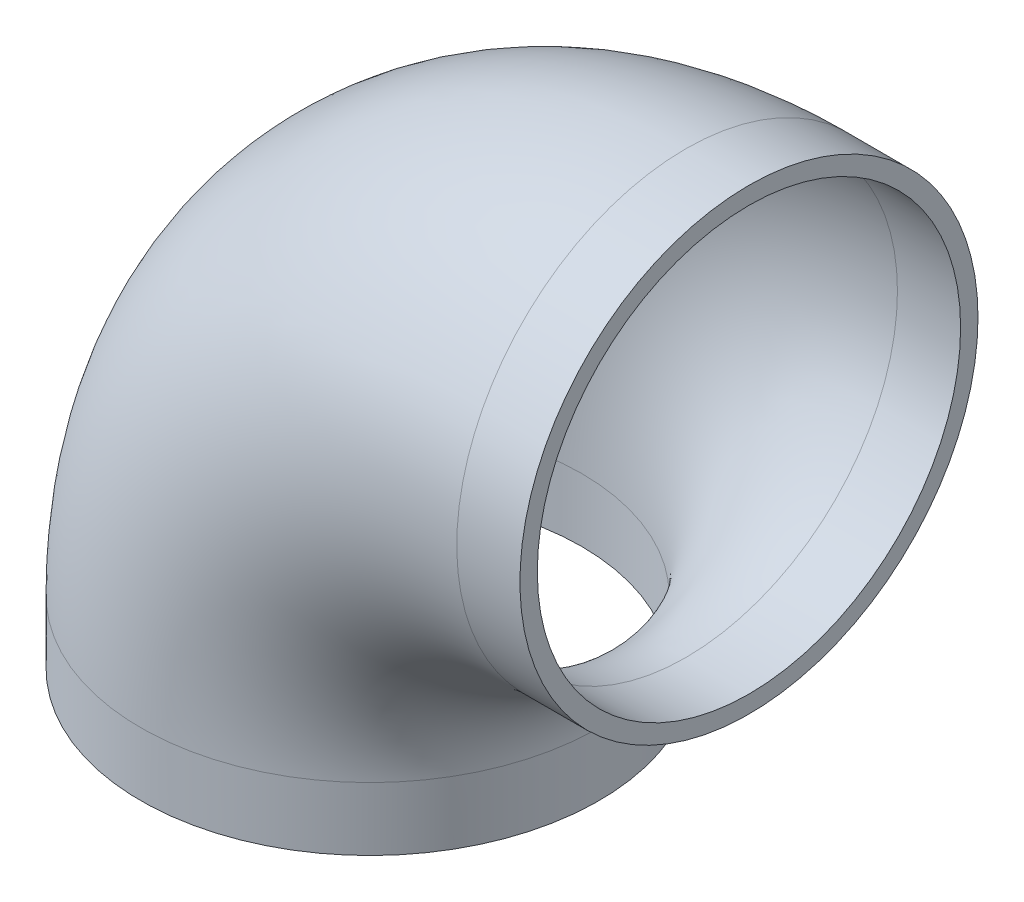
ISO-10303-21;
HEADER;
FILE_DESCRIPTION(('STEP AP214'),'2;1');
FILE_NAME('part.step','',(''),(''),'','','');
FILE_SCHEMA(('AUTOMOTIVE_DESIGN { 1 0 10303 214 1 1 1 1 }'));
ENDSEC;
DATA;
#1=APPLICATION_CONTEXT('core data for automotive mechanical design processes');
#2=APPLICATION_PROTOCOL_DEFINITION('international standard','automotive_design',2000,#1);
#3=PRODUCT_CONTEXT('',#1,'mechanical');
#4=PRODUCT('Part','Part','',(#3));
#5=PRODUCT_RELATED_PRODUCT_CATEGORY('part','',(#4));
#6=PRODUCT_DEFINITION_FORMATION('','',#4);
#7=PRODUCT_DEFINITION_CONTEXT('part definition',#1,'design');
#8=PRODUCT_DEFINITION('design','',#6,#7);
#9=PRODUCT_DEFINITION_SHAPE('','',#8);
#10=(LENGTH_UNIT() NAMED_UNIT(*) SI_UNIT(.MILLI.,.METRE.));
#11=(NAMED_UNIT(*) PLANE_ANGLE_UNIT() SI_UNIT($,.RADIAN.));
#12=(NAMED_UNIT(*) SI_UNIT($,.STERADIAN.) SOLID_ANGLE_UNIT());
#13=UNCERTAINTY_MEASURE_WITH_UNIT(LENGTH_MEASURE(1.E-05),#10,'distance_accuracy_value','');
#14=(GEOMETRIC_REPRESENTATION_CONTEXT(3) GLOBAL_UNCERTAINTY_ASSIGNED_CONTEXT((#13)) GLOBAL_UNIT_ASSIGNED_CONTEXT((#10,
#11,#12)) REPRESENTATION_CONTEXT('',''));
#15=CARTESIAN_POINT('',(0.,0.,0.));
#16=DIRECTION('',(0.,0.,1.));
#17=DIRECTION('',(1.,0.,0.));
#18=AXIS2_PLACEMENT_3D('',#15,#16,#17);
#19=CARTESIAN_POINT('',(30.,30.,0.));
#20=DIRECTION('',(1.,0.,0.));
#21=DIRECTION('',(0.,0.,-1.));
#22=AXIS2_PLACEMENT_3D('',#19,#20,#21);
#23=PLANE('',#22);
#24=CARTESIAN_POINT('',(30.,30.,0.));
#25=DIRECTION('',(1.,0.,0.));
#26=DIRECTION('',(0.,0.,-1.));
#27=AXIS2_PLACEMENT_3D('',#24,#25,#26);
#28=CIRCLE('',#27,33.5);
#29=CARTESIAN_POINT('',(30.,30.,-33.5));
#30=VERTEX_POINT('',#29);
#31=EDGE_CURVE('E91',#30,#30,#28,.T.);
#32=ORIENTED_EDGE('',*,*,#31,.F.);
#33=EDGE_LOOP('',(#32));
#34=FACE_BOUND('',#33,.T.);
#35=CARTESIAN_POINT('',(30.,30.,0.));
#36=DIRECTION('',(1.,0.,0.));
#37=DIRECTION('',(0.,0.,-1.));
#38=AXIS2_PLACEMENT_3D('',#35,#36,#37);
#39=CIRCLE('',#38,36.25);
#40=CARTESIAN_POINT('',(30.,30.,-36.25));
#41=VERTEX_POINT('',#40);
#42=EDGE_CURVE('E45',#41,#41,#39,.T.);
#43=ORIENTED_EDGE('',*,*,#42,.T.);
#44=EDGE_LOOP('',(#43));
#45=FACE_BOUND('',#44,.T.);
#46=ADVANCED_FACE('F33',(#34,#45),#23,.T.);
#47=CARTESIAN_POINT('',(-30.,-30.,0.));
#48=DIRECTION('',(0.,1.,0.));
#49=DIRECTION('',(0.,0.,-1.));
#50=AXIS2_PLACEMENT_3D('',#47,#48,#49);
#51=PLANE('',#50);
#52=CARTESIAN_POINT('',(-30.,-30.,0.));
#53=DIRECTION('',(0.,1.,0.));
#54=DIRECTION('',(0.,0.,1.));
#55=AXIS2_PLACEMENT_3D('',#52,#53,#54);
#56=CIRCLE('',#55,33.5);
#57=CARTESIAN_POINT('',(-30.,-30.,33.5));
#58=VERTEX_POINT('',#57);
#59=EDGE_CURVE('E87',#58,#58,#56,.T.);
#60=ORIENTED_EDGE('',*,*,#59,.T.);
#61=EDGE_LOOP('',(#60));
#62=FACE_BOUND('',#61,.T.);
#63=CARTESIAN_POINT('',(-30.,-30.,0.));
#64=DIRECTION('',(0.,1.,0.));
#65=DIRECTION('',(0.,0.,-1.));
#66=AXIS2_PLACEMENT_3D('',#63,#64,#65);
#67=CIRCLE('',#66,36.25);
#68=CARTESIAN_POINT('',(-30.,-30.,-36.25));
#69=VERTEX_POINT('',#68);
#70=EDGE_CURVE('E11',#69,#69,#67,.T.);
#71=ORIENTED_EDGE('',*,*,#70,.F.);
#72=EDGE_LOOP('',(#71));
#73=FACE_BOUND('',#72,.T.);
#74=ADVANCED_FACE('F51',(#62,#73),#51,.F.);
#75=CARTESIAN_POINT('',(30.,30.,0.));
#76=DIRECTION('',(-1.,0.,0.));
#77=DIRECTION('',(0.,0.,1.));
#78=AXIS2_PLACEMENT_3D('',#75,#76,#77);
#79=CYLINDRICAL_SURFACE('',#78,36.25);
#80=CARTESIAN_POINT('',(20.,30.,0.));
#81=DIRECTION('',(1.,0.,0.));
#82=DIRECTION('',(0.,0.,-1.));
#83=AXIS2_PLACEMENT_3D('',#80,#81,#82);
#84=CIRCLE('',#83,36.25);
#85=CARTESIAN_POINT('',(20.,66.25,0.));
#86=VERTEX_POINT('',#85);
#87=EDGE_CURVE('E101',#86,#86,#84,.T.);
#88=ORIENTED_EDGE('',*,*,#87,.T.);
#89=EDGE_LOOP('',(#88));
#90=FACE_BOUND('',#89,.T.);
#91=ORIENTED_EDGE('',*,*,#42,.F.);
#92=EDGE_LOOP('',(#91));
#93=FACE_BOUND('',#92,.T.);
#94=ADVANCED_FACE('F53',(#90,#93),#79,.T.);
#95=CARTESIAN_POINT('',(20.,-20.,0.));
#96=DIRECTION('',(0.,0.,1.));
#97=DIRECTION('',(1.,0.,0.));
#98=AXIS2_PLACEMENT_3D('',#95,#96,#97);
#99=TOROIDAL_SURFACE('',#98,50.,36.25);
#100=CARTESIAN_POINT('',(-30.,-20.,0.));
#101=DIRECTION('',(0.,1.,0.));
#102=DIRECTION('',(0.,0.,-1.));
#103=AXIS2_PLACEMENT_3D('',#100,#101,#102);
#104=CIRCLE('',#103,36.25);
#105=CARTESIAN_POINT('',(-66.25,-20.,0.));
#106=VERTEX_POINT('',#105);
#107=EDGE_CURVE('E40',#106,#106,#104,.T.);
#108=CARTESIAN_POINT('',(20.,-20.,0.));
#109=DIRECTION('',(0.,0.,1.));
#110=DIRECTION('',(1.,0.,0.));
#111=AXIS2_PLACEMENT_3D('',#108,#109,#110);
#112=CIRCLE('',#111,86.25);
#113=EDGE_CURVE('',#86,#106,#112,.T.);
#114=ORIENTED_EDGE('',*,*,#87,.F.);
#115=ORIENTED_EDGE('',*,*,#107,.T.);
#116=ORIENTED_EDGE('',*,*,#113,.T.);
#117=ORIENTED_EDGE('',*,*,#113,.F.);
#118=EDGE_LOOP('',(#114,#116,#115,#117));
#119=FACE_BOUND('',#118,.T.);
#120=ADVANCED_FACE('F59',(#119),#99,.T.);
#121=CARTESIAN_POINT('',(-30.,-20.,0.));
#122=DIRECTION('',(0.,-1.,0.));
#123=DIRECTION('',(0.,0.,-1.));
#124=AXIS2_PLACEMENT_3D('',#121,#122,#123);
#125=CYLINDRICAL_SURFACE('',#124,36.25);
#126=ORIENTED_EDGE('',*,*,#70,.T.);
#127=EDGE_LOOP('',(#126));
#128=FACE_BOUND('',#127,.T.);
#129=ORIENTED_EDGE('',*,*,#107,.F.);
#130=EDGE_LOOP('',(#129));
#131=FACE_BOUND('',#130,.T.);
#132=ADVANCED_FACE('F48',(#128,#131),#125,.T.);
#133=CARTESIAN_POINT('',(34.,30.,0.));
#134=DIRECTION('',(-1.,0.,0.));
#135=DIRECTION('',(0.,0.,1.));
#136=AXIS2_PLACEMENT_3D('',#133,#134,#135);
#137=CYLINDRICAL_SURFACE('',#136,33.5);
#138=CARTESIAN_POINT('',(20.,30.,0.));
#139=DIRECTION('',(1.,0.,0.));
#140=DIRECTION('',(0.,0.,-1.));
#141=AXIS2_PLACEMENT_3D('',#138,#139,#140);
#142=CIRCLE('',#141,33.5);
#143=CARTESIAN_POINT('',(19.9999999999999,63.5,0.));
#144=VERTEX_POINT('',#143);
#145=EDGE_CURVE('E92',#144,#144,#142,.T.);
#146=ORIENTED_EDGE('',*,*,#145,.F.);
#147=EDGE_LOOP('',(#146));
#148=FACE_BOUND('',#147,.T.);
#149=ORIENTED_EDGE('',*,*,#31,.T.);
#150=EDGE_LOOP('',(#149));
#151=FACE_BOUND('',#150,.T.);
#152=ADVANCED_FACE('F63',(#148,#151),#137,.F.);
#153=CARTESIAN_POINT('',(20.,-20.,0.));
#154=DIRECTION('',(0.,0.,1.));
#155=DIRECTION('',(1.,0.,0.));
#156=AXIS2_PLACEMENT_3D('',#153,#154,#155);
#157=TOROIDAL_SURFACE('',#156,50.,33.5);
#158=CARTESIAN_POINT('',(-30.,-20.,0.));
#159=DIRECTION('',(0.,1.,0.));
#160=DIRECTION('',(0.,0.,-1.));
#161=AXIS2_PLACEMENT_3D('',#158,#159,#160);
#162=CIRCLE('',#161,33.5);
#163=CARTESIAN_POINT('',(-63.5,-20.,0.));
#164=VERTEX_POINT('',#163);
#165=EDGE_CURVE('E90',#164,#164,#162,.T.);
#166=CARTESIAN_POINT('',(20.,-20.,0.));
#167=DIRECTION('',(0.,0.,1.));
#168=DIRECTION('',(1.,0.,0.));
#169=AXIS2_PLACEMENT_3D('',#166,#167,#168);
#170=CIRCLE('',#169,83.5);
#171=EDGE_CURVE('',#144,#164,#170,.T.);
#172=ORIENTED_EDGE('',*,*,#145,.T.);
#173=ORIENTED_EDGE('',*,*,#165,.F.);
#174=ORIENTED_EDGE('',*,*,#171,.T.);
#175=ORIENTED_EDGE('',*,*,#171,.F.);
#176=EDGE_LOOP('',(#172,#174,#173,#175));
#177=FACE_BOUND('',#176,.T.);
#178=ADVANCED_FACE('F71',(#177),#157,.F.);
#179=CARTESIAN_POINT('',(-30.,-20.,0.));
#180=DIRECTION('',(0.,-1.,0.));
#181=DIRECTION('',(0.,0.,-1.));
#182=AXIS2_PLACEMENT_3D('',#179,#180,#181);
#183=CYLINDRICAL_SURFACE('',#182,33.5);
#184=ORIENTED_EDGE('',*,*,#59,.F.);
#185=EDGE_LOOP('',(#184));
#186=FACE_BOUND('',#185,.T.);
#187=ORIENTED_EDGE('',*,*,#165,.T.);
#188=EDGE_LOOP('',(#187));
#189=FACE_BOUND('',#188,.T.);
#190=ADVANCED_FACE('F74',(#186,#189),#183,.F.);
#191=CLOSED_SHELL('',(#46,#74,#94,#120,#132,#152,#178,#190));
#192=MANIFOLD_SOLID_BREP('B2',#191);
#193=ADVANCED_BREP_SHAPE_REPRESENTATION('',(#18,#192),#14);
#194=SHAPE_DEFINITION_REPRESENTATION(#9,#193);
ENDSEC;
END-ISO-10303-21;
